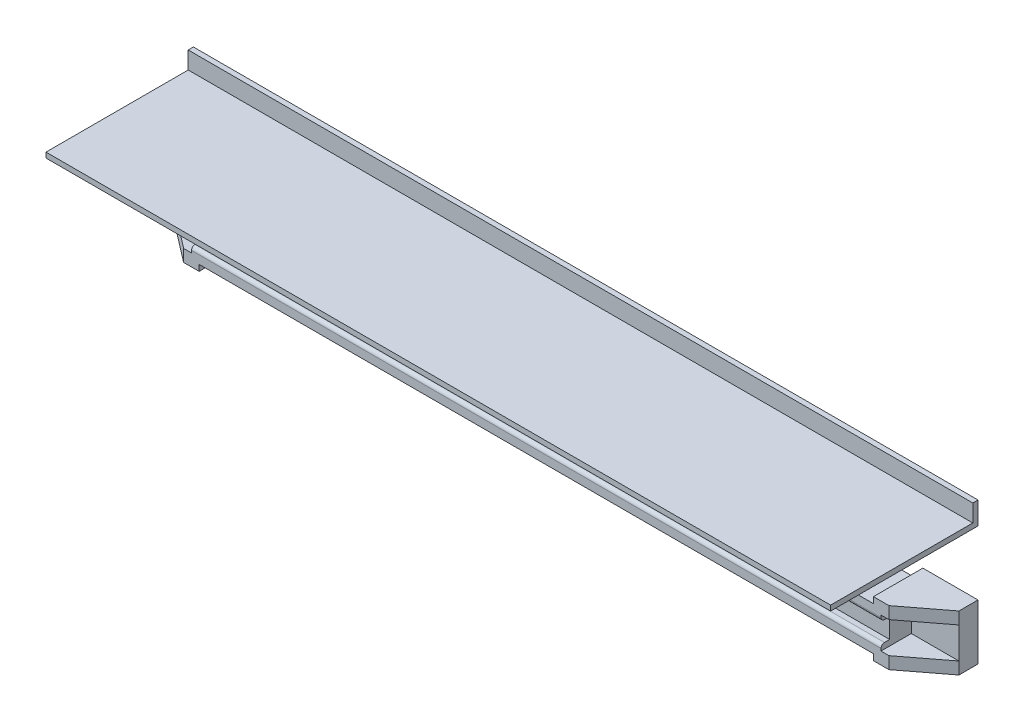
ISO-10303-21;
HEADER;
FILE_DESCRIPTION(('STEP AP214'),'2;1');
FILE_NAME('part.step','',(''),(''),'','','');
FILE_SCHEMA(('AUTOMOTIVE_DESIGN { 1 0 10303 214 1 1 1 1 }'));
ENDSEC;
DATA;
#1=APPLICATION_CONTEXT('core data for automotive mechanical design processes');
#2=APPLICATION_PROTOCOL_DEFINITION('international standard','automotive_design',2000,#1);
#3=PRODUCT_CONTEXT('',#1,'mechanical');
#4=PRODUCT('Part','Part','',(#3));
#5=PRODUCT_RELATED_PRODUCT_CATEGORY('part','',(#4));
#6=PRODUCT_DEFINITION_FORMATION('','',#4);
#7=PRODUCT_DEFINITION_CONTEXT('part definition',#1,'design');
#8=PRODUCT_DEFINITION('design','',#6,#7);
#9=PRODUCT_DEFINITION_SHAPE('','',#8);
#10=(LENGTH_UNIT() NAMED_UNIT(*) SI_UNIT(.MILLI.,.METRE.));
#11=(NAMED_UNIT(*) PLANE_ANGLE_UNIT() SI_UNIT($,.RADIAN.));
#12=(NAMED_UNIT(*) SI_UNIT($,.STERADIAN.) SOLID_ANGLE_UNIT());
#13=UNCERTAINTY_MEASURE_WITH_UNIT(LENGTH_MEASURE(1.E-05),#10,'distance_accuracy_value','');
#14=(GEOMETRIC_REPRESENTATION_CONTEXT(3) GLOBAL_UNCERTAINTY_ASSIGNED_CONTEXT((#13)) GLOBAL_UNIT_ASSIGNED_CONTEXT((#10,
#11,#12)) REPRESENTATION_CONTEXT('',''));
#15=CARTESIAN_POINT('',(0.,0.,0.));
#16=DIRECTION('',(0.,0.,1.));
#17=DIRECTION('',(1.,0.,0.));
#18=AXIS2_PLACEMENT_3D('',#15,#16,#17);
#19=CARTESIAN_POINT('',(-25.,0.,0.));
#20=DIRECTION('',(-1.,0.,0.));
#21=DIRECTION('',(0.,0.,1.));
#22=AXIS2_PLACEMENT_3D('',#19,#20,#21);
#23=PLANE('',#22);
#24=DIRECTION('',(0.,0.,1.));
#25=VECTOR('',#24,1.);
#26=CARTESIAN_POINT('',(-25.,78.4380776840292,-0.500000000000115));
#27=LINE('',#26,#25);
#28=CARTESIAN_POINT('',(-25.,78.4380776840293,-3.50000000000011));
#29=VERTEX_POINT('',#28);
#30=CARTESIAN_POINT('',(-25.,78.4380776840293,-0.500000000000115));
#31=VERTEX_POINT('',#30);
#32=EDGE_CURVE('E52',#29,#31,#27,.T.);
#33=ORIENTED_EDGE('',*,*,#32,.F.);
#34=DIRECTION('',(0.,1.,0.));
#35=VECTOR('',#34,1.);
#36=CARTESIAN_POINT('',(-25.,78.4380776840292,-3.50000000000011));
#37=LINE('',#36,#35);
#38=CARTESIAN_POINT('',(-25.,65.4380776840297,-3.50000000000012));
#39=VERTEX_POINT('',#38);
#40=EDGE_CURVE('E126',#39,#29,#37,.T.);
#41=ORIENTED_EDGE('',*,*,#40,.F.);
#42=DIRECTION('',(0.,0.,-1.));
#43=VECTOR('',#42,1.);
#44=CARTESIAN_POINT('',(-25.,65.4380776840297,-3.50000000000012));
#45=LINE('',#44,#43);
#46=CARTESIAN_POINT('',(-25.,65.4380776840297,81.4999999999974));
#47=VERTEX_POINT('',#46);
#48=EDGE_CURVE('E130',#47,#39,#45,.T.);
#49=ORIENTED_EDGE('',*,*,#48,.F.);
#50=DIRECTION('',(0.,-1.,0.));
#51=VECTOR('',#50,1.);
#52=CARTESIAN_POINT('',(-25.,65.4380776840297,81.4999999999974));
#53=LINE('',#52,#51);
#54=CARTESIAN_POINT('',(-25.,68.4380776840297,81.4999999999974));
#55=VERTEX_POINT('',#54);
#56=EDGE_CURVE('E81',#55,#47,#53,.T.);
#57=ORIENTED_EDGE('',*,*,#56,.F.);
#58=DIRECTION('',(0.,0.,1.));
#59=VECTOR('',#58,1.);
#60=CARTESIAN_POINT('',(-25.,68.4380776840297,81.4999999999974));
#61=LINE('',#60,#59);
#62=CARTESIAN_POINT('',(-25.,68.4380776840297,-0.500000000000115));
#63=VERTEX_POINT('',#62);
#64=EDGE_CURVE('E86',#63,#55,#61,.T.);
#65=ORIENTED_EDGE('',*,*,#64,.F.);
#66=DIRECTION('',(0.,-1.,0.));
#67=VECTOR('',#66,1.);
#68=CARTESIAN_POINT('',(-25.,68.4380776840297,-0.500000000000115));
#69=LINE('',#68,#67);
#70=EDGE_CURVE('E107',#31,#63,#69,.T.);
#71=ORIENTED_EDGE('',*,*,#70,.F.);
#72=EDGE_LOOP('',(#33,#41,#49,#57,#65,#71));
#73=FACE_BOUND('',#72,.T.);
#74=ADVANCED_FACE('F44',(#73),#23,.T.);
#75=CARTESIAN_POINT('',(427.448100551703,0.,0.));
#76=DIRECTION('',(-1.,0.,0.));
#77=DIRECTION('',(0.,0.,1.));
#78=AXIS2_PLACEMENT_3D('',#75,#76,#77);
#79=PLANE('',#78);
#80=DIRECTION('',(0.,0.,1.));
#81=VECTOR('',#80,1.);
#82=CARTESIAN_POINT('',(427.448100551703,78.4380776840293,-0.500000000000115));
#83=LINE('',#82,#81);
#84=CARTESIAN_POINT('',(427.448100551703,78.4380776840293,-3.50000000000011));
#85=VERTEX_POINT('',#84);
#86=CARTESIAN_POINT('',(427.448100551703,78.4380776840293,-0.500000000000115));
#87=VERTEX_POINT('',#86);
#88=EDGE_CURVE('E117',#85,#87,#83,.T.);
#89=ORIENTED_EDGE('',*,*,#88,.T.);
#90=DIRECTION('',(0.,-1.,0.));
#91=VECTOR('',#90,1.);
#92=CARTESIAN_POINT('',(427.448100551703,68.4380776840298,-0.500000000000115));
#93=LINE('',#92,#91);
#94=CARTESIAN_POINT('',(427.448100551703,68.4380776840298,-0.500000000000115));
#95=VERTEX_POINT('',#94);
#96=EDGE_CURVE('E105',#87,#95,#93,.T.);
#97=ORIENTED_EDGE('',*,*,#96,.T.);
#98=DIRECTION('',(0.,0.,1.));
#99=VECTOR('',#98,1.);
#100=CARTESIAN_POINT('',(427.448100551703,68.4380776840298,81.4999999999974));
#101=LINE('',#100,#99);
#102=CARTESIAN_POINT('',(427.448100551703,68.4380776840298,81.4999999999974));
#103=VERTEX_POINT('',#102);
#104=EDGE_CURVE('E109',#95,#103,#101,.T.);
#105=ORIENTED_EDGE('',*,*,#104,.T.);
#106=DIRECTION('',(0.,-1.,0.));
#107=VECTOR('',#106,1.);
#108=CARTESIAN_POINT('',(427.448100551703,65.4380776840298,81.4999999999974));
#109=LINE('',#108,#107);
#110=CARTESIAN_POINT('',(427.448100551703,65.4380776840298,81.4999999999974));
#111=VERTEX_POINT('',#110);
#112=EDGE_CURVE('E113',#103,#111,#109,.T.);
#113=ORIENTED_EDGE('',*,*,#112,.T.);
#114=DIRECTION('',(0.,0.,-1.));
#115=VECTOR('',#114,1.);
#116=CARTESIAN_POINT('',(427.448100551703,65.4380776840298,-3.50000000000012));
#117=LINE('',#116,#115);
#118=CARTESIAN_POINT('',(427.448100551703,65.4380776840298,-3.50000000000012));
#119=VERTEX_POINT('',#118);
#120=EDGE_CURVE('E145',#111,#119,#117,.T.);
#121=ORIENTED_EDGE('',*,*,#120,.T.);
#122=DIRECTION('',(0.,1.,0.));
#123=VECTOR('',#122,1.);
#124=CARTESIAN_POINT('',(427.448100551703,78.4380776840293,-3.50000000000011));
#125=LINE('',#124,#123);
#126=EDGE_CURVE('E123',#119,#85,#125,.T.);
#127=ORIENTED_EDGE('',*,*,#126,.T.);
#128=EDGE_LOOP('',(#89,#97,#105,#113,#121,#127));
#129=FACE_BOUND('',#128,.T.);
#130=ADVANCED_FACE('F115',(#129),#79,.F.);
#131=CARTESIAN_POINT('',(-110.98837130682,68.4380776840297,-0.500000000000115));
#132=DIRECTION('',(0.,0.,1.));
#133=DIRECTION('',(0.,-1.,0.));
#134=AXIS2_PLACEMENT_3D('',#131,#132,#133);
#135=PLANE('',#134);
#136=DIRECTION('',(1.,0.,0.));
#137=VECTOR('',#136,1.);
#138=CARTESIAN_POINT('',(-110.98837130682,78.4380776840292,-0.500000000000115));
#139=LINE('',#138,#137);
#140=EDGE_CURVE('E12',#31,#87,#139,.T.);
#141=ORIENTED_EDGE('',*,*,#140,.F.);
#142=ORIENTED_EDGE('',*,*,#70,.T.);
#143=DIRECTION('',(1.,0.,0.));
#144=VECTOR('',#143,1.);
#145=CARTESIAN_POINT('',(-110.98837130682,68.4380776840297,-0.500000000000115));
#146=LINE('',#145,#144);
#147=EDGE_CURVE('E102',#63,#95,#146,.T.);
#148=ORIENTED_EDGE('',*,*,#147,.T.);
#149=ORIENTED_EDGE('',*,*,#96,.F.);
#150=EDGE_LOOP('',(#141,#142,#148,#149));
#151=FACE_BOUND('',#150,.T.);
#152=ADVANCED_FACE('F103',(#151),#135,.T.);
#153=CARTESIAN_POINT('',(-110.98837130682,68.4380776840297,81.4999999999974));
#154=DIRECTION('',(0.,1.,0.));
#155=DIRECTION('',(-1.,0.,0.));
#156=AXIS2_PLACEMENT_3D('',#153,#154,#155);
#157=PLANE('',#156);
#158=ORIENTED_EDGE('',*,*,#147,.F.);
#159=ORIENTED_EDGE('',*,*,#64,.T.);
#160=DIRECTION('',(1.,0.,0.));
#161=VECTOR('',#160,1.);
#162=CARTESIAN_POINT('',(-110.98837130682,68.4380776840297,81.4999999999974));
#163=LINE('',#162,#161);
#164=EDGE_CURVE('E97',#55,#103,#163,.T.);
#165=ORIENTED_EDGE('',*,*,#164,.T.);
#166=ORIENTED_EDGE('',*,*,#104,.F.);
#167=EDGE_LOOP('',(#158,#159,#165,#166));
#168=FACE_BOUND('',#167,.T.);
#169=ADVANCED_FACE('F110',(#168),#157,.T.);
#170=CARTESIAN_POINT('',(-110.98837130682,65.4380776840297,81.4999999999974));
#171=DIRECTION('',(0.,0.,1.));
#172=DIRECTION('',(1.,0.,0.));
#173=AXIS2_PLACEMENT_3D('',#170,#171,#172);
#174=PLANE('',#173);
#175=ORIENTED_EDGE('',*,*,#164,.F.);
#176=ORIENTED_EDGE('',*,*,#56,.T.);
#177=DIRECTION('',(1.,0.,0.));
#178=VECTOR('',#177,1.);
#179=CARTESIAN_POINT('',(-110.98837130682,65.4380776840297,81.4999999999974));
#180=LINE('',#179,#178);
#181=EDGE_CURVE('E133',#47,#111,#180,.T.);
#182=ORIENTED_EDGE('',*,*,#181,.T.);
#183=ORIENTED_EDGE('',*,*,#112,.F.);
#184=EDGE_LOOP('',(#175,#176,#182,#183));
#185=FACE_BOUND('',#184,.T.);
#186=ADVANCED_FACE('F142',(#185),#174,.T.);
#187=CARTESIAN_POINT('',(-110.98837130682,65.4380776840297,-3.50000000000012));
#188=DIRECTION('',(0.,-1.,0.));
#189=DIRECTION('',(0.,0.,-1.));
#190=AXIS2_PLACEMENT_3D('',#187,#188,#189);
#191=PLANE('',#190);
#192=ORIENTED_EDGE('',*,*,#181,.F.);
#193=ORIENTED_EDGE('',*,*,#48,.T.);
#194=DIRECTION('',(1.,0.,0.));
#195=VECTOR('',#194,1.);
#196=CARTESIAN_POINT('',(-110.98837130682,65.4380776840297,-3.50000000000012));
#197=LINE('',#196,#195);
#198=EDGE_CURVE('E129',#39,#119,#197,.T.);
#199=ORIENTED_EDGE('',*,*,#198,.T.);
#200=ORIENTED_EDGE('',*,*,#120,.F.);
#201=EDGE_LOOP('',(#192,#193,#199,#200));
#202=FACE_BOUND('',#201,.T.);
#203=ADVANCED_FACE('F146',(#202),#191,.T.);
#204=CARTESIAN_POINT('',(-110.98837130682,78.4380776840292,-3.50000000000011));
#205=DIRECTION('',(0.,0.,-1.));
#206=DIRECTION('',(0.,1.,0.));
#207=AXIS2_PLACEMENT_3D('',#204,#205,#206);
#208=PLANE('',#207);
#209=ORIENTED_EDGE('',*,*,#198,.F.);
#210=ORIENTED_EDGE('',*,*,#40,.T.);
#211=DIRECTION('',(1.,0.,0.));
#212=VECTOR('',#211,1.);
#213=CARTESIAN_POINT('',(-110.98837130682,78.4380776840292,-3.50000000000011));
#214=LINE('',#213,#212);
#215=EDGE_CURVE('E125',#29,#85,#214,.T.);
#216=ORIENTED_EDGE('',*,*,#215,.T.);
#217=ORIENTED_EDGE('',*,*,#126,.F.);
#218=EDGE_LOOP('',(#209,#210,#216,#217));
#219=FACE_BOUND('',#218,.T.);
#220=ADVANCED_FACE('F152',(#219),#208,.T.);
#221=CARTESIAN_POINT('',(-110.98837130682,78.4380776840292,-0.500000000000115));
#222=DIRECTION('',(0.,1.,0.));
#223=DIRECTION('',(-1.,0.,0.));
#224=AXIS2_PLACEMENT_3D('',#221,#222,#223);
#225=PLANE('',#224);
#226=ORIENTED_EDGE('',*,*,#215,.F.);
#227=ORIENTED_EDGE('',*,*,#32,.T.);
#228=ORIENTED_EDGE('',*,*,#140,.T.);
#229=ORIENTED_EDGE('',*,*,#88,.F.);
#230=EDGE_LOOP('',(#226,#227,#228,#229));
#231=FACE_BOUND('',#230,.T.);
#232=ADVANCED_FACE('F154',(#231),#225,.T.);
#233=CLOSED_SHELL('',(#74,#130,#152,#169,#186,#203,#220,#232));
#234=MANIFOLD_SOLID_BREP('B2',#233);
#235=CARTESIAN_POINT('',(400.,0.,25.));
#236=DIRECTION('',(-1.,0.,0.));
#237=DIRECTION('',(0.,0.,1.));
#238=AXIS2_PLACEMENT_3D('',#235,#236,#237);
#239=PLANE('',#238);
#240=DIRECTION('',(0.,0.,1.));
#241=VECTOR('',#240,1.);
#242=CARTESIAN_POINT('',(400.,21.5,7.5));
#243=LINE('',#242,#241);
#244=CARTESIAN_POINT('',(400.,21.5,7.5));
#245=VERTEX_POINT('',#244);
#246=CARTESIAN_POINT('',(400.,21.5,25.));
#247=VERTEX_POINT('',#246);
#248=EDGE_CURVE('E461',#245,#247,#243,.T.);
#249=ORIENTED_EDGE('',*,*,#248,.T.);
#250=DIRECTION('',(0.,1.,0.));
#251=VECTOR('',#250,1.);
#252=CARTESIAN_POINT('',(400.,0.,25.));
#253=LINE('',#252,#251);
#254=CARTESIAN_POINT('',(400.,20.2000000000001,25.));
#255=VERTEX_POINT('',#254);
#256=EDGE_CURVE('E427',#255,#247,#253,.T.);
#257=ORIENTED_EDGE('',*,*,#256,.F.);
#258=CARTESIAN_POINT('',(400.,20.2000000000001,23.));
#259=DIRECTION('',(-1.,0.,0.));
#260=DIRECTION('',(0.,0.,1.));
#261=AXIS2_PLACEMENT_3D('',#258,#259,#260);
#262=CIRCLE('',#261,2.);
#263=CARTESIAN_POINT('',(400.,18.2,23.));
#264=VERTEX_POINT('',#263);
#265=EDGE_CURVE('E519',#264,#255,#262,.T.);
#266=ORIENTED_EDGE('',*,*,#265,.F.);
#267=DIRECTION('',(0.,0.,1.));
#268=VECTOR('',#267,1.);
#269=CARTESIAN_POINT('',(400.,18.2,25.));
#270=LINE('',#269,#268);
#271=CARTESIAN_POINT('',(400.,18.2,20.));
#272=VERTEX_POINT('',#271);
#273=EDGE_CURVE('E517',#272,#264,#270,.T.);
#274=ORIENTED_EDGE('',*,*,#273,.F.);
#275=DIRECTION('',(0.,1.,0.));
#276=VECTOR('',#275,1.);
#277=CARTESIAN_POINT('',(400.,0.,20.));
#278=LINE('',#277,#276);
#279=CARTESIAN_POINT('',(400.,6.80000000000005,20.));
#280=VERTEX_POINT('',#279);
#281=EDGE_CURVE('E528',#280,#272,#278,.T.);
#282=ORIENTED_EDGE('',*,*,#281,.F.);
#283=DIRECTION('',(0.,0.,-1.));
#284=VECTOR('',#283,1.);
#285=CARTESIAN_POINT('',(400.,6.80000000000005,25.));
#286=LINE('',#285,#284);
#287=CARTESIAN_POINT('',(400.,6.80000000000005,23.));
#288=VERTEX_POINT('',#287);
#289=EDGE_CURVE('E525',#288,#280,#286,.T.);
#290=ORIENTED_EDGE('',*,*,#289,.F.);
#291=CARTESIAN_POINT('',(400.,4.80000000000005,23.));
#292=DIRECTION('',(-1.,0.,0.));
#293=DIRECTION('',(0.,0.,1.));
#294=AXIS2_PLACEMENT_3D('',#291,#292,#293);
#295=CIRCLE('',#294,2.);
#296=CARTESIAN_POINT('',(400.,4.80000000000003,25.));
#297=VERTEX_POINT('',#296);
#298=EDGE_CURVE('E522',#297,#288,#295,.T.);
#299=ORIENTED_EDGE('',*,*,#298,.F.);
#300=CARTESIAN_POINT('',(400.,3.50000000000002,25.));
#301=VERTEX_POINT('',#300);
#302=EDGE_CURVE('E601',#301,#297,#253,.T.);
#303=ORIENTED_EDGE('',*,*,#302,.F.);
#304=DIRECTION('',(0.,0.,1.));
#305=VECTOR('',#304,1.);
#306=CARTESIAN_POINT('',(400.,3.50000000000002,7.5));
#307=LINE('',#306,#305);
#308=CARTESIAN_POINT('',(400.,3.50000000000002,7.5));
#309=VERTEX_POINT('',#308);
#310=EDGE_CURVE('E460',#309,#301,#307,.T.);
#311=ORIENTED_EDGE('',*,*,#310,.F.);
#312=DIRECTION('',(0.,1.,0.));
#313=VECTOR('',#312,1.);
#314=CARTESIAN_POINT('',(400.,21.5,7.5));
#315=LINE('',#314,#313);
#316=EDGE_CURVE('E456',#309,#245,#315,.T.);
#317=ORIENTED_EDGE('',*,*,#316,.T.);
#318=EDGE_LOOP('',(#249,#257,#266,#274,#282,#290,#299,#303,#311,#317));
#319=FACE_BOUND('',#318,.T.);
#320=ADVANCED_FACE('F219',(#319),#239,.F.);
#321=CARTESIAN_POINT('',(0.,0.,25.));
#322=DIRECTION('',(0.,1.,0.));
#323=DIRECTION('',(0.,0.,1.));
#324=AXIS2_PLACEMENT_3D('',#321,#322,#323);
#325=PLANE('',#324);
#326=DIRECTION('',(0.,0.,-1.));
#327=VECTOR('',#326,1.);
#328=CARTESIAN_POINT('',(395.648100551703,0.,25.));
#329=LINE('',#328,#327);
#330=CARTESIAN_POINT('',(395.648100551703,0.,25.));
#331=VERTEX_POINT('',#330);
#332=CARTESIAN_POINT('',(395.648100551703,0.,0.));
#333=VERTEX_POINT('',#332);
#334=EDGE_CURVE('E234',#331,#333,#329,.T.);
#335=ORIENTED_EDGE('',*,*,#334,.F.);
#336=DIRECTION('',(1.,0.,0.));
#337=VECTOR('',#336,1.);
#338=CARTESIAN_POINT('',(0.,0.,25.));
#339=LINE('',#338,#337);
#340=CARTESIAN_POINT('',(6.8,0.,25.));
#341=VERTEX_POINT('',#340);
#342=EDGE_CURVE('E597',#341,#331,#339,.T.);
#343=ORIENTED_EDGE('',*,*,#342,.F.);
#344=DIRECTION('',(0.,0.,-1.));
#345=VECTOR('',#344,1.);
#346=CARTESIAN_POINT('',(6.8,0.,25.));
#347=LINE('',#346,#345);
#348=CARTESIAN_POINT('',(6.8,0.,0.));
#349=VERTEX_POINT('',#348);
#350=EDGE_CURVE('E565',#341,#349,#347,.T.);
#351=ORIENTED_EDGE('',*,*,#350,.T.);
#352=DIRECTION('',(1.,0.,0.));
#353=VECTOR('',#352,1.);
#354=CARTESIAN_POINT('',(0.,0.,0.));
#355=LINE('',#354,#353);
#356=EDGE_CURVE('E596',#349,#333,#355,.T.);
#357=ORIENTED_EDGE('',*,*,#356,.T.);
#358=EDGE_LOOP('',(#335,#343,#351,#357));
#359=FACE_BOUND('',#358,.T.);
#360=ADVANCED_FACE('F221',(#359),#325,.F.);
#361=CARTESIAN_POINT('',(0.,25.,25.));
#362=DIRECTION('',(0.,-1.,0.));
#363=DIRECTION('',(0.,0.,-1.));
#364=AXIS2_PLACEMENT_3D('',#361,#362,#363);
#365=PLANE('',#364);
#366=DIRECTION('',(0.,0.,1.));
#367=VECTOR('',#366,1.);
#368=CARTESIAN_POINT('',(395.648100551703,25.,0.));
#369=LINE('',#368,#367);
#370=CARTESIAN_POINT('',(395.648100551703,25.,0.));
#371=VERTEX_POINT('',#370);
#372=CARTESIAN_POINT('',(395.648100551703,25.,25.));
#373=VERTEX_POINT('',#372);
#374=EDGE_CURVE('E463',#371,#373,#369,.T.);
#375=ORIENTED_EDGE('',*,*,#374,.F.);
#376=DIRECTION('',(-1.,0.,0.));
#377=VECTOR('',#376,1.);
#378=CARTESIAN_POINT('',(0.,25.,0.));
#379=LINE('',#378,#377);
#380=CARTESIAN_POINT('',(6.8,25.,0.));
#381=VERTEX_POINT('',#380);
#382=EDGE_CURVE('E600',#371,#381,#379,.T.);
#383=ORIENTED_EDGE('',*,*,#382,.T.);
#384=DIRECTION('',(0.,0.,1.));
#385=VECTOR('',#384,1.);
#386=CARTESIAN_POINT('',(6.8,25.,0.));
#387=LINE('',#386,#385);
#388=CARTESIAN_POINT('',(6.8,25.,25.));
#389=VERTEX_POINT('',#388);
#390=EDGE_CURVE('E560',#381,#389,#387,.T.);
#391=ORIENTED_EDGE('',*,*,#390,.T.);
#392=DIRECTION('',(-1.,0.,0.));
#393=VECTOR('',#392,1.);
#394=CARTESIAN_POINT('',(0.,25.,25.));
#395=LINE('',#394,#393);
#396=EDGE_CURVE('E603',#373,#389,#395,.T.);
#397=ORIENTED_EDGE('',*,*,#396,.F.);
#398=EDGE_LOOP('',(#375,#383,#391,#397));
#399=FACE_BOUND('',#398,.T.);
#400=ADVANCED_FACE('F721',(#399),#365,.F.);
#401=CARTESIAN_POINT('',(0.,0.,0.));
#402=DIRECTION('',(0.,0.,-1.));
#403=DIRECTION('',(-1.,0.,0.));
#404=AXIS2_PLACEMENT_3D('',#401,#402,#403);
#405=PLANE('',#404);
#406=ORIENTED_EDGE('',*,*,#382,.F.);
#407=DIRECTION('',(0.,1.,0.));
#408=VECTOR('',#407,1.);
#409=CARTESIAN_POINT('',(395.648100551703,0.,0.));
#410=LINE('',#409,#408);
#411=EDGE_CURVE('E468',#333,#371,#410,.T.);
#412=ORIENTED_EDGE('',*,*,#411,.F.);
#413=ORIENTED_EDGE('',*,*,#356,.F.);
#414=DIRECTION('',(0.,1.,0.));
#415=VECTOR('',#414,1.);
#416=CARTESIAN_POINT('',(6.8,0.,0.));
#417=LINE('',#416,#415);
#418=EDGE_CURVE('E568',#349,#381,#417,.T.);
#419=ORIENTED_EDGE('',*,*,#418,.T.);
#420=EDGE_LOOP('',(#406,#412,#413,#419));
#421=FACE_BOUND('',#420,.T.);
#422=ADVANCED_FACE('F725',(#421),#405,.T.);
#423=CARTESIAN_POINT('',(-25.,28.5,28.5));
#424=DIRECTION('',(0.,-1.,0.));
#425=DIRECTION('',(0.,0.,-1.));
#426=AXIS2_PLACEMENT_3D('',#423,#424,#425);
#427=PLANE('',#426);
#428=DIRECTION('',(-1.,0.,0.));
#429=VECTOR('',#428,1.);
#430=CARTESIAN_POINT('',(-25.,28.5,25.));
#431=LINE('',#430,#429);
#432=CARTESIAN_POINT('',(6.79999999999999,28.5,25.));
#433=VERTEX_POINT('',#432);
#434=CARTESIAN_POINT('',(-2.12658287358067,28.5,25.));
#435=VERTEX_POINT('',#434);
#436=EDGE_CURVE('E242',#433,#435,#431,.T.);
#437=ORIENTED_EDGE('',*,*,#436,.F.);
#438=DIRECTION('',(0.,0.,1.));
#439=VECTOR('',#438,1.);
#440=CARTESIAN_POINT('',(6.8,28.5,-3.5));
#441=LINE('',#440,#439);
#442=CARTESIAN_POINT('',(6.8,28.5,-3.5));
#443=VERTEX_POINT('',#442);
#444=EDGE_CURVE('E576',#443,#433,#441,.T.);
#445=ORIENTED_EDGE('',*,*,#444,.F.);
#446=DIRECTION('',(1.,0.,0.));
#447=VECTOR('',#446,1.);
#448=CARTESIAN_POINT('',(-25.,28.5,-3.5));
#449=LINE('',#448,#447);
#450=CARTESIAN_POINT('',(-25.,28.5,-3.5));
#451=VERTEX_POINT('',#450);
#452=EDGE_CURVE('E587',#451,#443,#449,.T.);
#453=ORIENTED_EDGE('',*,*,#452,.F.);
#454=DIRECTION('',(0.,0.,-1.));
#455=VECTOR('',#454,1.);
#456=CARTESIAN_POINT('',(-25.,28.5,28.5));
#457=LINE('',#456,#455);
#458=CARTESIAN_POINT('',(-25.,28.5,7.5));
#459=VERTEX_POINT('',#458);
#460=EDGE_CURVE('E585',#459,#451,#457,.T.);
#461=ORIENTED_EDGE('',*,*,#460,.F.);
#462=DIRECTION('',(-0.794214335112172,0.,-0.607637712705796));
#463=VECTOR('',#462,1.);
#464=CARTESIAN_POINT('',(-14.8655137783,28.5,15.2536953879489));
#465=LINE('',#464,#463);
#466=EDGE_CURVE('E542',#435,#459,#465,.T.);
#467=ORIENTED_EDGE('',*,*,#466,.F.);
#468=EDGE_LOOP('',(#437,#445,#453,#461,#467));
#469=FACE_BOUND('',#468,.T.);
#470=ADVANCED_FACE('F729',(#469),#427,.F.);
#471=CARTESIAN_POINT('',(-25.,-3.50000000000001,-3.5));
#472=DIRECTION('',(0.,1.,0.));
#473=DIRECTION('',(0.,0.,1.));
#474=AXIS2_PLACEMENT_3D('',#471,#472,#473);
#475=PLANE('',#474);
#476=DIRECTION('',(1.,0.,0.));
#477=VECTOR('',#476,1.);
#478=CARTESIAN_POINT('',(-25.,-3.50000000000001,25.));
#479=LINE('',#478,#477);
#480=CARTESIAN_POINT('',(-2.12658287358067,-3.5,25.));
#481=VERTEX_POINT('',#480);
#482=CARTESIAN_POINT('',(6.8,-3.50000000000001,25.));
#483=VERTEX_POINT('',#482);
#484=EDGE_CURVE('E511',#481,#483,#479,.T.);
#485=ORIENTED_EDGE('',*,*,#484,.F.);
#486=DIRECTION('',(-0.794214335112172,0.,-0.607637712705796));
#487=VECTOR('',#486,1.);
#488=CARTESIAN_POINT('',(-12.8500491124511,-3.50000000000001,16.7956876253754));
#489=LINE('',#488,#487);
#490=CARTESIAN_POINT('',(-25.,-3.50000000000001,7.5));
#491=VERTEX_POINT('',#490);
#492=EDGE_CURVE('E531',#481,#491,#489,.T.);
#493=ORIENTED_EDGE('',*,*,#492,.T.);
#494=DIRECTION('',(0.,0.,1.));
#495=VECTOR('',#494,1.);
#496=CARTESIAN_POINT('',(-25.,-3.50000000000001,-3.5));
#497=LINE('',#496,#495);
#498=CARTESIAN_POINT('',(-25.,-3.50000000000001,-3.5));
#499=VERTEX_POINT('',#498);
#500=EDGE_CURVE('E582',#499,#491,#497,.T.);
#501=ORIENTED_EDGE('',*,*,#500,.F.);
#502=DIRECTION('',(1.,0.,0.));
#503=VECTOR('',#502,1.);
#504=CARTESIAN_POINT('',(-25.,-3.50000000000001,-3.5));
#505=LINE('',#504,#503);
#506=CARTESIAN_POINT('',(6.8,-3.5,-3.5));
#507=VERTEX_POINT('',#506);
#508=EDGE_CURVE('E589',#499,#507,#505,.T.);
#509=ORIENTED_EDGE('',*,*,#508,.T.);
#510=DIRECTION('',(0.,0.,-1.));
#511=VECTOR('',#510,1.);
#512=CARTESIAN_POINT('',(6.8,-3.5,28.5));
#513=LINE('',#512,#511);
#514=EDGE_CURVE('E571',#483,#507,#513,.T.);
#515=ORIENTED_EDGE('',*,*,#514,.F.);
#516=EDGE_LOOP('',(#485,#493,#501,#509,#515));
#517=FACE_BOUND('',#516,.T.);
#518=ADVANCED_FACE('F656',(#517),#475,.F.);
#519=CARTESIAN_POINT('',(-25.,21.5,7.5));
#520=DIRECTION('',(0.,1.,0.));
#521=DIRECTION('',(0.,0.,1.));
#522=AXIS2_PLACEMENT_3D('',#519,#520,#521);
#523=PLANE('',#522);
#524=DIRECTION('',(1.,0.,0.));
#525=VECTOR('',#524,1.);
#526=CARTESIAN_POINT('',(-25.,21.5,25.));
#527=LINE('',#526,#525);
#528=CARTESIAN_POINT('',(-2.12658287358067,21.5,25.));
#529=VERTEX_POINT('',#528);
#530=CARTESIAN_POINT('',(2.44810055170319,21.5,25.));
#531=VERTEX_POINT('',#530);
#532=EDGE_CURVE('E502',#529,#531,#527,.T.);
#533=ORIENTED_EDGE('',*,*,#532,.F.);
#534=DIRECTION('',(0.794214335112172,0.,0.607637712705796));
#535=VECTOR('',#534,1.);
#536=CARTESIAN_POINT('',(-25.,21.5,7.49999999999999));
#537=LINE('',#536,#535);
#538=CARTESIAN_POINT('',(-25.,21.5,7.5));
#539=VERTEX_POINT('',#538);
#540=EDGE_CURVE('E539',#539,#529,#537,.T.);
#541=ORIENTED_EDGE('',*,*,#540,.F.);
#542=DIRECTION('',(-1.,0.,0.));
#543=VECTOR('',#542,1.);
#544=CARTESIAN_POINT('',(-25.,21.5,7.5));
#545=LINE('',#544,#543);
#546=CARTESIAN_POINT('',(2.44810055170319,21.5,7.5));
#547=VERTEX_POINT('',#546);
#548=EDGE_CURVE('E553',#547,#539,#545,.T.);
#549=ORIENTED_EDGE('',*,*,#548,.F.);
#550=DIRECTION('',(0.,0.,1.));
#551=VECTOR('',#550,1.);
#552=CARTESIAN_POINT('',(2.44810055170319,21.5,7.5));
#553=LINE('',#552,#551);
#554=EDGE_CURVE('E557',#547,#531,#553,.T.);
#555=ORIENTED_EDGE('',*,*,#554,.T.);
#556=EDGE_LOOP('',(#533,#541,#549,#555));
#557=FACE_BOUND('',#556,.T.);
#558=ADVANCED_FACE('F701',(#557),#523,.F.);
#559=CARTESIAN_POINT('',(-25.,3.49999999999999,7.5));
#560=DIRECTION('',(0.,-1.,0.));
#561=DIRECTION('',(0.,0.,-1.));
#562=AXIS2_PLACEMENT_3D('',#559,#560,#561);
#563=PLANE('',#562);
#564=DIRECTION('',(-1.,0.,0.));
#565=VECTOR('',#564,1.);
#566=CARTESIAN_POINT('',(-25.,3.49999999999999,25.));
#567=LINE('',#566,#565);
#568=CARTESIAN_POINT('',(2.44810055170319,3.49999999999999,25.));
#569=VERTEX_POINT('',#568);
#570=CARTESIAN_POINT('',(-2.12658287358067,3.5,25.));
#571=VERTEX_POINT('',#570);
#572=EDGE_CURVE('E509',#569,#571,#567,.T.);
#573=ORIENTED_EDGE('',*,*,#572,.F.);
#574=DIRECTION('',(0.,0.,1.));
#575=VECTOR('',#574,1.);
#576=CARTESIAN_POINT('',(2.44810055170319,3.49999999999999,7.5));
#577=LINE('',#576,#575);
#578=CARTESIAN_POINT('',(2.44810055170319,3.49999999999999,7.5));
#579=VERTEX_POINT('',#578);
#580=EDGE_CURVE('E556',#579,#569,#577,.T.);
#581=ORIENTED_EDGE('',*,*,#580,.F.);
#582=DIRECTION('',(1.,0.,0.));
#583=VECTOR('',#582,1.);
#584=CARTESIAN_POINT('',(-25.,3.49999999999999,7.5));
#585=LINE('',#584,#583);
#586=CARTESIAN_POINT('',(-25.,3.5,7.5));
#587=VERTEX_POINT('',#586);
#588=EDGE_CURVE('E547',#587,#579,#585,.T.);
#589=ORIENTED_EDGE('',*,*,#588,.F.);
#590=DIRECTION('',(-0.794214335112172,0.,-0.607637712705796));
#591=VECTOR('',#590,1.);
#592=CARTESIAN_POINT('',(-25.,3.49999999999999,7.5));
#593=LINE('',#592,#591);
#594=EDGE_CURVE('E537',#571,#587,#593,.T.);
#595=ORIENTED_EDGE('',*,*,#594,.F.);
#596=EDGE_LOOP('',(#573,#581,#589,#595));
#597=FACE_BOUND('',#596,.T.);
#598=ADVANCED_FACE('F642',(#597),#563,.F.);
#599=CARTESIAN_POINT('',(0.,0.,25.));
#600=DIRECTION('',(0.,0.,-1.));
#601=DIRECTION('',(-1.,0.,0.));
#602=AXIS2_PLACEMENT_3D('',#599,#600,#601);
#603=PLANE('',#602);
#604=DIRECTION('',(1.,0.,0.));
#605=VECTOR('',#604,1.);
#606=CARTESIAN_POINT('',(427.448100551703,3.50000000000002,25.));
#607=LINE('',#606,#605);
#608=CARTESIAN_POINT('',(404.574683425284,3.50000000000002,25.));
#609=VERTEX_POINT('',#608);
#610=EDGE_CURVE('E434',#301,#609,#607,.T.);
#611=ORIENTED_EDGE('',*,*,#610,.F.);
#612=ORIENTED_EDGE('',*,*,#302,.T.);
#613=DIRECTION('',(1.,0.,0.));
#614=VECTOR('',#613,1.);
#615=CARTESIAN_POINT('',(-40.5518994482968,4.79999999999998,25.));
#616=LINE('',#615,#614);
#617=CARTESIAN_POINT('',(2.44810055170319,4.79999999999999,25.));
#618=VERTEX_POINT('',#617);
#619=EDGE_CURVE('E497',#618,#297,#616,.T.);
#620=ORIENTED_EDGE('',*,*,#619,.F.);
#621=DIRECTION('',(0.,-1.,0.));
#622=VECTOR('',#621,1.);
#623=CARTESIAN_POINT('',(2.44810055170319,21.5,25.));
#624=LINE('',#623,#622);
#625=EDGE_CURVE('E513',#618,#569,#624,.T.);
#626=ORIENTED_EDGE('',*,*,#625,.T.);
#627=ORIENTED_EDGE('',*,*,#572,.T.);
#628=DIRECTION('',(0.,1.,0.));
#629=VECTOR('',#628,1.);
#630=CARTESIAN_POINT('',(-2.12658287358067,39.5,25.));
#631=LINE('',#630,#629);
#632=EDGE_CURVE('E610',#481,#571,#631,.T.);
#633=ORIENTED_EDGE('',*,*,#632,.F.);
#634=ORIENTED_EDGE('',*,*,#484,.T.);
#635=DIRECTION('',(0.,1.,0.));
#636=VECTOR('',#635,1.);
#637=CARTESIAN_POINT('',(6.8,18.2,25.));
#638=LINE('',#637,#636);
#639=EDGE_CURVE('E515',#483,#341,#638,.T.);
#640=ORIENTED_EDGE('',*,*,#639,.T.);
#641=ORIENTED_EDGE('',*,*,#342,.T.);
#642=DIRECTION('',(0.,1.,0.));
#643=VECTOR('',#642,1.);
#644=CARTESIAN_POINT('',(395.648100551703,18.2,25.));
#645=LINE('',#644,#643);
#646=CARTESIAN_POINT('',(395.648100551703,-3.49999999999998,25.));
#647=VERTEX_POINT('',#646);
#648=EDGE_CURVE('E440',#647,#331,#645,.T.);
#649=ORIENTED_EDGE('',*,*,#648,.F.);
#650=DIRECTION('',(-1.,0.,0.));
#651=VECTOR('',#650,1.);
#652=CARTESIAN_POINT('',(427.448100551703,-3.49999999999998,25.));
#653=LINE('',#652,#651);
#654=CARTESIAN_POINT('',(404.574683425284,-3.49999999999998,25.));
#655=VERTEX_POINT('',#654);
#656=EDGE_CURVE('E437',#655,#647,#653,.T.);
#657=ORIENTED_EDGE('',*,*,#656,.F.);
#658=DIRECTION('',(0.,1.,0.));
#659=VECTOR('',#658,1.);
#660=CARTESIAN_POINT('',(404.574683425284,39.5,25.));
#661=LINE('',#660,#659);
#662=EDGE_CURVE('E413',#655,#609,#661,.T.);
#663=ORIENTED_EDGE('',*,*,#662,.T.);
#664=EDGE_LOOP('',(#611,#612,#620,#626,#627,#633,#634,#640,#641,#649,#657,#663));
#665=FACE_BOUND('',#664,.T.);
#666=ADVANCED_FACE('F639',(#665),#603,.F.);
#667=CARTESIAN_POINT('',(6.8,18.2,20.));
#668=DIRECTION('',(-1.,0.,0.));
#669=DIRECTION('',(0.,-1.,0.));
#670=AXIS2_PLACEMENT_3D('',#667,#668,#669);
#671=PLANE('',#670);
#672=ORIENTED_EDGE('',*,*,#639,.F.);
#673=ORIENTED_EDGE('',*,*,#514,.T.);
#674=DIRECTION('',(0.,1.,0.));
#675=VECTOR('',#674,1.);
#676=CARTESIAN_POINT('',(6.8,-3.5,-3.5));
#677=LINE('',#676,#675);
#678=EDGE_CURVE('E573',#507,#443,#677,.T.);
#679=ORIENTED_EDGE('',*,*,#678,.T.);
#680=ORIENTED_EDGE('',*,*,#444,.T.);
#681=DIRECTION('',(0.,1.,0.));
#682=VECTOR('',#681,1.);
#683=CARTESIAN_POINT('',(6.8,18.2,25.));
#684=LINE('',#683,#682);
#685=EDGE_CURVE('E507',#389,#433,#684,.T.);
#686=ORIENTED_EDGE('',*,*,#685,.F.);
#687=ORIENTED_EDGE('',*,*,#390,.F.);
#688=ORIENTED_EDGE('',*,*,#418,.F.);
#689=ORIENTED_EDGE('',*,*,#350,.F.);
#690=EDGE_LOOP('',(#672,#673,#679,#680,#686,#687,#688,#689));
#691=FACE_BOUND('',#690,.T.);
#692=ADVANCED_FACE('F662',(#691),#671,.F.);
#693=CARTESIAN_POINT('',(2.44810055170319,21.5,7.5));
#694=DIRECTION('',(1.,0.,0.));
#695=DIRECTION('',(0.,1.,0.));
#696=AXIS2_PLACEMENT_3D('',#693,#694,#695);
#697=PLANE('',#696);
#698=ORIENTED_EDGE('',*,*,#625,.F.);
#699=CARTESIAN_POINT('',(2.44810055170319,4.8,23.));
#700=DIRECTION('',(1.,0.,0.));
#701=DIRECTION('',(0.,1.,0.));
#702=AXIS2_PLACEMENT_3D('',#699,#700,#701);
#703=CIRCLE('',#702,2.);
#704=CARTESIAN_POINT('',(2.44810055170319,6.8,23.));
#705=VERTEX_POINT('',#704);
#706=EDGE_CURVE('E42',#705,#618,#703,.T.);
#707=ORIENTED_EDGE('',*,*,#706,.F.);
#708=DIRECTION('',(0.,0.,1.));
#709=VECTOR('',#708,1.);
#710=CARTESIAN_POINT('',(2.44810055170319,6.8,7.5));
#711=LINE('',#710,#709);
#712=CARTESIAN_POINT('',(2.44810055170319,6.8,20.));
#713=VERTEX_POINT('',#712);
#714=EDGE_CURVE('E227',#713,#705,#711,.T.);
#715=ORIENTED_EDGE('',*,*,#714,.F.);
#716=DIRECTION('',(0.,-1.,0.));
#717=VECTOR('',#716,1.);
#718=CARTESIAN_POINT('',(2.44810055170319,21.5,20.));
#719=LINE('',#718,#717);
#720=CARTESIAN_POINT('',(2.44810055170319,18.2,20.));
#721=VERTEX_POINT('',#720);
#722=EDGE_CURVE('E619',#721,#713,#719,.T.);
#723=ORIENTED_EDGE('',*,*,#722,.F.);
#724=DIRECTION('',(0.,0.,-1.));
#725=VECTOR('',#724,1.);
#726=CARTESIAN_POINT('',(2.44810055170319,18.2,7.5));
#727=LINE('',#726,#725);
#728=CARTESIAN_POINT('',(2.44810055170319,18.2,23.));
#729=VERTEX_POINT('',#728);
#730=EDGE_CURVE('E613',#729,#721,#727,.T.);
#731=ORIENTED_EDGE('',*,*,#730,.F.);
#732=CARTESIAN_POINT('',(2.44810055170319,20.2,23.));
#733=DIRECTION('',(1.,0.,0.));
#734=DIRECTION('',(0.,1.,0.));
#735=AXIS2_PLACEMENT_3D('',#732,#733,#734);
#736=CIRCLE('',#735,2.);
#737=CARTESIAN_POINT('',(2.44810055170319,20.2,25.));
#738=VERTEX_POINT('',#737);
#739=EDGE_CURVE('E616',#738,#729,#736,.T.);
#740=ORIENTED_EDGE('',*,*,#739,.F.);
#741=DIRECTION('',(0.,-1.,0.));
#742=VECTOR('',#741,1.);
#743=CARTESIAN_POINT('',(2.44810055170319,21.5,25.));
#744=LINE('',#743,#742);
#745=EDGE_CURVE('E505',#531,#738,#744,.T.);
#746=ORIENTED_EDGE('',*,*,#745,.F.);
#747=ORIENTED_EDGE('',*,*,#554,.F.);
#748=DIRECTION('',(0.,1.,0.));
#749=VECTOR('',#748,1.);
#750=CARTESIAN_POINT('',(2.44810055170319,21.5,7.5));
#751=LINE('',#750,#749);
#752=EDGE_CURVE('E550',#579,#547,#751,.T.);
#753=ORIENTED_EDGE('',*,*,#752,.F.);
#754=ORIENTED_EDGE('',*,*,#580,.T.);
#755=EDGE_LOOP('',(#698,#707,#715,#723,#731,#740,#746,#747,#753,#754));
#756=FACE_BOUND('',#755,.T.);
#757=ADVANCED_FACE('F634',(#756),#697,.F.);
#758=CARTESIAN_POINT('',(-12.8500491124511,39.5,16.7956876253754));
#759=DIRECTION('',(-0.607637712705796,0.,0.794214335112172));
#760=DIRECTION('',(0.794214335112172,0.,0.607637712705796));
#761=AXIS2_PLACEMENT_3D('',#758,#759,#760);
#762=PLANE('',#761);
#763=ORIENTED_EDGE('',*,*,#492,.F.);
#764=ORIENTED_EDGE('',*,*,#632,.T.);
#765=ORIENTED_EDGE('',*,*,#594,.T.);
#766=DIRECTION('',(0.,-1.,0.));
#767=VECTOR('',#766,1.);
#768=CARTESIAN_POINT('',(-25.,39.5,7.5));
#769=LINE('',#768,#767);
#770=EDGE_CURVE('E533',#587,#491,#769,.T.);
#771=ORIENTED_EDGE('',*,*,#770,.T.);
#772=EDGE_LOOP('',(#763,#764,#765,#771));
#773=FACE_BOUND('',#772,.T.);
#774=ADVANCED_FACE('F647',(#773),#762,.T.);
#775=ORIENTED_EDGE('',*,*,#540,.T.);
#776=DIRECTION('',(0.,1.,0.));
#777=VECTOR('',#776,1.);
#778=CARTESIAN_POINT('',(-2.12658287358067,39.5,25.));
#779=LINE('',#778,#777);
#780=EDGE_CURVE('E605',#529,#435,#779,.T.);
#781=ORIENTED_EDGE('',*,*,#780,.T.);
#782=ORIENTED_EDGE('',*,*,#466,.T.);
#783=EDGE_CURVE('E536',#459,#539,#769,.T.);
#784=ORIENTED_EDGE('',*,*,#783,.T.);
#785=EDGE_LOOP('',(#775,#781,#782,#784));
#786=FACE_BOUND('',#785,.T.);
#787=ADVANCED_FACE('F749',(#786),#762,.T.);
#788=CARTESIAN_POINT('',(-25.,0.,0.));
#789=DIRECTION('',(-1.,0.,0.));
#790=DIRECTION('',(0.,0.,1.));
#791=AXIS2_PLACEMENT_3D('',#788,#789,#790);
#792=PLANE('',#791);
#793=ORIENTED_EDGE('',*,*,#500,.T.);
#794=ORIENTED_EDGE('',*,*,#770,.F.);
#795=DIRECTION('',(0.,-1.,0.));
#796=VECTOR('',#795,1.);
#797=CARTESIAN_POINT('',(-25.,21.5,7.5));
#798=LINE('',#797,#796);
#799=EDGE_CURVE('E544',#539,#587,#798,.T.);
#800=ORIENTED_EDGE('',*,*,#799,.F.);
#801=ORIENTED_EDGE('',*,*,#783,.F.);
#802=ORIENTED_EDGE('',*,*,#460,.T.);
#803=DIRECTION('',(0.,-1.,0.));
#804=VECTOR('',#803,1.);
#805=CARTESIAN_POINT('',(-25.,28.5,-3.5));
#806=LINE('',#805,#804);
#807=EDGE_CURVE('E579',#451,#499,#806,.T.);
#808=ORIENTED_EDGE('',*,*,#807,.T.);
#809=EDGE_LOOP('',(#793,#794,#800,#801,#802,#808));
#810=FACE_BOUND('',#809,.T.);
#811=ADVANCED_FACE('F650',(#810),#792,.T.);
#812=ORIENTED_EDGE('',*,*,#256,.T.);
#813=DIRECTION('',(-1.,0.,0.));
#814=VECTOR('',#813,1.);
#815=CARTESIAN_POINT('',(427.448100551703,21.5,25.));
#816=LINE('',#815,#814);
#817=CARTESIAN_POINT('',(404.574683425284,21.5,25.));
#818=VERTEX_POINT('',#817);
#819=EDGE_CURVE('E419',#818,#247,#816,.T.);
#820=ORIENTED_EDGE('',*,*,#819,.F.);
#821=DIRECTION('',(0.,1.,0.));
#822=VECTOR('',#821,1.);
#823=CARTESIAN_POINT('',(404.574683425284,39.5,25.));
#824=LINE('',#823,#822);
#825=CARTESIAN_POINT('',(404.574683425284,28.5,25.));
#826=VERTEX_POINT('',#825);
#827=EDGE_CURVE('E403',#818,#826,#824,.T.);
#828=ORIENTED_EDGE('',*,*,#827,.T.);
#829=DIRECTION('',(1.,0.,0.));
#830=VECTOR('',#829,1.);
#831=CARTESIAN_POINT('',(427.448100551703,28.5,25.));
#832=LINE('',#831,#830);
#833=CARTESIAN_POINT('',(395.648100551703,28.5,25.));
#834=VERTEX_POINT('',#833);
#835=EDGE_CURVE('E428',#834,#826,#832,.T.);
#836=ORIENTED_EDGE('',*,*,#835,.F.);
#837=DIRECTION('',(0.,1.,0.));
#838=VECTOR('',#837,1.);
#839=CARTESIAN_POINT('',(395.648100551703,18.2,25.));
#840=LINE('',#839,#838);
#841=EDGE_CURVE('E430',#373,#834,#840,.T.);
#842=ORIENTED_EDGE('',*,*,#841,.F.);
#843=ORIENTED_EDGE('',*,*,#396,.T.);
#844=ORIENTED_EDGE('',*,*,#685,.T.);
#845=ORIENTED_EDGE('',*,*,#436,.T.);
#846=ORIENTED_EDGE('',*,*,#780,.F.);
#847=ORIENTED_EDGE('',*,*,#532,.T.);
#848=ORIENTED_EDGE('',*,*,#745,.T.);
#849=DIRECTION('',(1.,0.,0.));
#850=VECTOR('',#849,1.);
#851=CARTESIAN_POINT('',(-40.5518994482968,20.2,25.));
#852=LINE('',#851,#850);
#853=EDGE_CURVE('E495',#738,#255,#852,.T.);
#854=ORIENTED_EDGE('',*,*,#853,.T.);
#855=EDGE_LOOP('',(#812,#820,#828,#836,#842,#843,#844,#845,#846,#847,#848,#854));
#856=FACE_BOUND('',#855,.T.);
#857=ADVANCED_FACE('F425',(#856),#603,.F.);
#858=CARTESIAN_POINT('',(-25.,28.5,-3.5));
#859=DIRECTION('',(0.,0.,1.));
#860=DIRECTION('',(1.,0.,0.));
#861=AXIS2_PLACEMENT_3D('',#858,#859,#860);
#862=PLANE('',#861);
#863=ORIENTED_EDGE('',*,*,#452,.T.);
#864=ORIENTED_EDGE('',*,*,#678,.F.);
#865=ORIENTED_EDGE('',*,*,#508,.F.);
#866=ORIENTED_EDGE('',*,*,#807,.F.);
#867=EDGE_LOOP('',(#863,#864,#865,#866));
#868=FACE_BOUND('',#867,.T.);
#869=ADVANCED_FACE('F706',(#868),#862,.F.);
#870=CARTESIAN_POINT('',(0.,0.,7.5));
#871=DIRECTION('',(0.,0.,1.));
#872=DIRECTION('',(1.,0.,0.));
#873=AXIS2_PLACEMENT_3D('',#870,#871,#872);
#874=PLANE('',#873);
#875=ORIENTED_EDGE('',*,*,#799,.T.);
#876=ORIENTED_EDGE('',*,*,#588,.T.);
#877=ORIENTED_EDGE('',*,*,#752,.T.);
#878=ORIENTED_EDGE('',*,*,#548,.T.);
#879=EDGE_LOOP('',(#875,#876,#877,#878));
#880=FACE_BOUND('',#879,.T.);
#881=ADVANCED_FACE('F704',(#880),#874,.T.);
#882=CARTESIAN_POINT('',(-40.5518994482968,4.79999999999999,23.));
#883=DIRECTION('',(1.,0.,0.));
#884=DIRECTION('',(0.,1.,0.));
#885=AXIS2_PLACEMENT_3D('',#882,#883,#884);
#886=CYLINDRICAL_SURFACE('',#885,2.);
#887=ORIENTED_EDGE('',*,*,#298,.T.);
#888=DIRECTION('',(1.,0.,0.));
#889=VECTOR('',#888,1.);
#890=CARTESIAN_POINT('',(-40.5518994482968,6.79999999999999,23.));
#891=LINE('',#890,#889);
#892=EDGE_CURVE('E500',#705,#288,#891,.T.);
#893=ORIENTED_EDGE('',*,*,#892,.F.);
#894=ORIENTED_EDGE('',*,*,#706,.T.);
#895=ORIENTED_EDGE('',*,*,#619,.T.);
#896=EDGE_LOOP('',(#887,#893,#894,#895));
#897=FACE_BOUND('',#896,.T.);
#898=ADVANCED_FACE('F629',(#897),#886,.T.);
#899=CARTESIAN_POINT('',(-40.5518994482968,20.2,23.));
#900=DIRECTION('',(1.,0.,0.));
#901=DIRECTION('',(0.,1.,0.));
#902=AXIS2_PLACEMENT_3D('',#899,#900,#901);
#903=CYLINDRICAL_SURFACE('',#902,2.);
#904=ORIENTED_EDGE('',*,*,#265,.T.);
#905=ORIENTED_EDGE('',*,*,#853,.F.);
#906=ORIENTED_EDGE('',*,*,#739,.T.);
#907=DIRECTION('',(1.,0.,0.));
#908=VECTOR('',#907,1.);
#909=CARTESIAN_POINT('',(-40.5518994482968,18.2,23.));
#910=LINE('',#909,#908);
#911=EDGE_CURVE('E492',#729,#264,#910,.T.);
#912=ORIENTED_EDGE('',*,*,#911,.T.);
#913=EDGE_LOOP('',(#904,#905,#906,#912));
#914=FACE_BOUND('',#913,.T.);
#915=ADVANCED_FACE('F697',(#914),#903,.T.);
#916=CARTESIAN_POINT('',(6.8,6.8,20.));
#917=DIRECTION('',(0.,-1.,0.));
#918=DIRECTION('',(1.,0.,0.));
#919=AXIS2_PLACEMENT_3D('',#916,#917,#918);
#920=PLANE('',#919);
#921=DIRECTION('',(1.,0.,0.));
#922=VECTOR('',#921,1.);
#923=CARTESIAN_POINT('',(6.8,6.8,20.));
#924=LINE('',#923,#922);
#925=EDGE_CURVE('E594',#713,#280,#924,.T.);
#926=ORIENTED_EDGE('',*,*,#925,.F.);
#927=ORIENTED_EDGE('',*,*,#714,.T.);
#928=ORIENTED_EDGE('',*,*,#892,.T.);
#929=ORIENTED_EDGE('',*,*,#289,.T.);
#930=EDGE_LOOP('',(#926,#927,#928,#929));
#931=FACE_BOUND('',#930,.T.);
#932=ADVANCED_FACE('F624',(#931),#920,.F.);
#933=CARTESIAN_POINT('',(393.2,18.2000000000001,20.));
#934=DIRECTION('',(0.,1.,0.));
#935=DIRECTION('',(-1.,0.,0.));
#936=AXIS2_PLACEMENT_3D('',#933,#934,#935);
#937=PLANE('',#936);
#938=ORIENTED_EDGE('',*,*,#911,.F.);
#939=ORIENTED_EDGE('',*,*,#730,.T.);
#940=DIRECTION('',(-1.,0.,0.));
#941=VECTOR('',#940,1.);
#942=CARTESIAN_POINT('',(393.2,18.2000000000001,20.));
#943=LINE('',#942,#941);
#944=EDGE_CURVE('E592',#272,#721,#943,.T.);
#945=ORIENTED_EDGE('',*,*,#944,.F.);
#946=ORIENTED_EDGE('',*,*,#273,.T.);
#947=EDGE_LOOP('',(#938,#939,#945,#946));
#948=FACE_BOUND('',#947,.T.);
#949=ADVANCED_FACE('F694',(#948),#937,.F.);
#950=CARTESIAN_POINT('',(0.,0.,20.));
#951=DIRECTION('',(0.,0.,1.));
#952=DIRECTION('',(1.,0.,0.));
#953=AXIS2_PLACEMENT_3D('',#950,#951,#952);
#954=PLANE('',#953);
#955=ORIENTED_EDGE('',*,*,#944,.T.);
#956=ORIENTED_EDGE('',*,*,#722,.T.);
#957=ORIENTED_EDGE('',*,*,#925,.T.);
#958=ORIENTED_EDGE('',*,*,#281,.T.);
#959=EDGE_LOOP('',(#955,#956,#957,#958));
#960=FACE_BOUND('',#959,.T.);
#961=ADVANCED_FACE('F689',(#960),#954,.T.);
#962=CARTESIAN_POINT('',(427.448100551703,28.5,28.5));
#963=DIRECTION('',(0.,-1.,0.));
#964=DIRECTION('',(0.,0.,-1.));
#965=AXIS2_PLACEMENT_3D('',#962,#963,#964);
#966=PLANE('',#965);
#967=ORIENTED_EDGE('',*,*,#835,.T.);
#968=DIRECTION('',(0.794214335112172,0.,-0.607637712705796));
#969=VECTOR('',#968,1.);
#970=CARTESIAN_POINT('',(417.313614330003,28.5,15.2536953879489));
#971=LINE('',#970,#969);
#972=CARTESIAN_POINT('',(427.448100551703,28.5,7.5));
#973=VERTEX_POINT('',#972);
#974=EDGE_CURVE('E409',#826,#973,#971,.T.);
#975=ORIENTED_EDGE('',*,*,#974,.T.);
#976=DIRECTION('',(0.,0.,-1.));
#977=VECTOR('',#976,1.);
#978=CARTESIAN_POINT('',(427.448100551703,28.5,28.5));
#979=LINE('',#978,#977);
#980=CARTESIAN_POINT('',(427.448100551703,28.5,-3.5));
#981=VERTEX_POINT('',#980);
#982=EDGE_CURVE('E483',#973,#981,#979,.T.);
#983=ORIENTED_EDGE('',*,*,#982,.T.);
#984=DIRECTION('',(-1.,0.,0.));
#985=VECTOR('',#984,1.);
#986=CARTESIAN_POINT('',(427.448100551703,28.5,-3.5));
#987=LINE('',#986,#985);
#988=CARTESIAN_POINT('',(395.648100551703,28.5,-3.5));
#989=VERTEX_POINT('',#988);
#990=EDGE_CURVE('E486',#981,#989,#987,.T.);
#991=ORIENTED_EDGE('',*,*,#990,.T.);
#992=DIRECTION('',(0.,0.,1.));
#993=VECTOR('',#992,1.);
#994=CARTESIAN_POINT('',(395.648100551703,28.5,-3.5));
#995=LINE('',#994,#993);
#996=EDGE_CURVE('E475',#989,#834,#995,.T.);
#997=ORIENTED_EDGE('',*,*,#996,.T.);
#998=EDGE_LOOP('',(#967,#975,#983,#991,#997));
#999=FACE_BOUND('',#998,.T.);
#1000=ADVANCED_FACE('F740',(#999),#966,.F.);
#1001=CARTESIAN_POINT('',(427.448100551703,-3.49999999999998,-3.5));
#1002=DIRECTION('',(0.,1.,0.));
#1003=DIRECTION('',(0.,0.,1.));
#1004=AXIS2_PLACEMENT_3D('',#1001,#1002,#1003);
#1005=PLANE('',#1004);
#1006=ORIENTED_EDGE('',*,*,#656,.T.);
#1007=DIRECTION('',(0.,0.,-1.));
#1008=VECTOR('',#1007,1.);
#1009=CARTESIAN_POINT('',(395.648100551703,-3.49999999999998,28.5));
#1010=LINE('',#1009,#1008);
#1011=CARTESIAN_POINT('',(395.648100551703,-3.49999999999998,-3.5));
#1012=VERTEX_POINT('',#1011);
#1013=EDGE_CURVE('E470',#647,#1012,#1010,.T.);
#1014=ORIENTED_EDGE('',*,*,#1013,.T.);
#1015=DIRECTION('',(-1.,0.,0.));
#1016=VECTOR('',#1015,1.);
#1017=CARTESIAN_POINT('',(427.448100551703,-3.49999999999998,-3.5));
#1018=LINE('',#1017,#1016);
#1019=CARTESIAN_POINT('',(427.448100551703,-3.49999999999998,-3.5));
#1020=VERTEX_POINT('',#1019);
#1021=EDGE_CURVE('E414',#1020,#1012,#1018,.T.);
#1022=ORIENTED_EDGE('',*,*,#1021,.F.);
#1023=DIRECTION('',(0.,0.,1.));
#1024=VECTOR('',#1023,1.);
#1025=CARTESIAN_POINT('',(427.448100551703,-3.49999999999998,-3.5));
#1026=LINE('',#1025,#1024);
#1027=CARTESIAN_POINT('',(427.448100551703,-3.49999999999998,7.5));
#1028=VERTEX_POINT('',#1027);
#1029=EDGE_CURVE('E480',#1020,#1028,#1026,.T.);
#1030=ORIENTED_EDGE('',*,*,#1029,.T.);
#1031=DIRECTION('',(0.794214335112172,0.,-0.607637712705796));
#1032=VECTOR('',#1031,1.);
#1033=CARTESIAN_POINT('',(415.298149664154,-3.49999999999998,16.7956876253754));
#1034=LINE('',#1033,#1032);
#1035=EDGE_CURVE('E442',#655,#1028,#1034,.T.);
#1036=ORIENTED_EDGE('',*,*,#1035,.F.);
#1037=EDGE_LOOP('',(#1006,#1014,#1022,#1030,#1036));
#1038=FACE_BOUND('',#1037,.T.);
#1039=ADVANCED_FACE('F674',(#1038),#1005,.F.);
#1040=CARTESIAN_POINT('',(427.448100551703,21.5,7.5));
#1041=DIRECTION('',(0.,1.,0.));
#1042=DIRECTION('',(0.,0.,1.));
#1043=AXIS2_PLACEMENT_3D('',#1040,#1041,#1042);
#1044=PLANE('',#1043);
#1045=ORIENTED_EDGE('',*,*,#819,.T.);
#1046=ORIENTED_EDGE('',*,*,#248,.F.);
#1047=DIRECTION('',(1.,0.,0.));
#1048=VECTOR('',#1047,1.);
#1049=CARTESIAN_POINT('',(427.448100551703,21.5,7.5));
#1050=LINE('',#1049,#1048);
#1051=CARTESIAN_POINT('',(427.448100551703,21.5,7.5));
#1052=VERTEX_POINT('',#1051);
#1053=EDGE_CURVE('E421',#245,#1052,#1050,.T.);
#1054=ORIENTED_EDGE('',*,*,#1053,.T.);
#1055=DIRECTION('',(-0.794214335112172,0.,0.607637712705796));
#1056=VECTOR('',#1055,1.);
#1057=CARTESIAN_POINT('',(427.448100551703,21.5,7.49999999999999));
#1058=LINE('',#1057,#1056);
#1059=EDGE_CURVE('E406',#1052,#818,#1058,.T.);
#1060=ORIENTED_EDGE('',*,*,#1059,.T.);
#1061=EDGE_LOOP('',(#1045,#1046,#1054,#1060));
#1062=FACE_BOUND('',#1061,.T.);
#1063=ADVANCED_FACE('F417',(#1062),#1044,.F.);
#1064=CARTESIAN_POINT('',(427.448100551703,3.50000000000002,7.5));
#1065=DIRECTION('',(0.,-1.,0.));
#1066=DIRECTION('',(0.,0.,-1.));
#1067=AXIS2_PLACEMENT_3D('',#1064,#1065,#1066);
#1068=PLANE('',#1067);
#1069=ORIENTED_EDGE('',*,*,#610,.T.);
#1070=DIRECTION('',(0.794214335112172,0.,-0.607637712705796));
#1071=VECTOR('',#1070,1.);
#1072=CARTESIAN_POINT('',(427.448100551703,3.50000000000002,7.5));
#1073=LINE('',#1072,#1071);
#1074=CARTESIAN_POINT('',(427.448100551703,3.50000000000002,7.5));
#1075=VERTEX_POINT('',#1074);
#1076=EDGE_CURVE('E422',#609,#1075,#1073,.T.);
#1077=ORIENTED_EDGE('',*,*,#1076,.T.);
#1078=DIRECTION('',(-1.,0.,0.));
#1079=VECTOR('',#1078,1.);
#1080=CARTESIAN_POINT('',(427.448100551703,3.50000000000002,7.5));
#1081=LINE('',#1080,#1079);
#1082=EDGE_CURVE('E453',#1075,#309,#1081,.T.);
#1083=ORIENTED_EDGE('',*,*,#1082,.T.);
#1084=ORIENTED_EDGE('',*,*,#310,.T.);
#1085=EDGE_LOOP('',(#1069,#1077,#1083,#1084));
#1086=FACE_BOUND('',#1085,.T.);
#1087=ADVANCED_FACE('F947',(#1086),#1068,.F.);
#1088=CARTESIAN_POINT('',(395.648100551703,18.2,20.));
#1089=DIRECTION('',(1.,0.,0.));
#1090=DIRECTION('',(0.,-1.,0.));
#1091=AXIS2_PLACEMENT_3D('',#1088,#1089,#1090);
#1092=PLANE('',#1091);
#1093=ORIENTED_EDGE('',*,*,#648,.T.);
#1094=ORIENTED_EDGE('',*,*,#334,.T.);
#1095=ORIENTED_EDGE('',*,*,#411,.T.);
#1096=ORIENTED_EDGE('',*,*,#374,.T.);
#1097=ORIENTED_EDGE('',*,*,#841,.T.);
#1098=ORIENTED_EDGE('',*,*,#996,.F.);
#1099=DIRECTION('',(0.,1.,0.));
#1100=VECTOR('',#1099,1.);
#1101=CARTESIAN_POINT('',(395.648100551703,-3.49999999999998,-3.5));
#1102=LINE('',#1101,#1100);
#1103=EDGE_CURVE('E473',#1012,#989,#1102,.T.);
#1104=ORIENTED_EDGE('',*,*,#1103,.F.);
#1105=ORIENTED_EDGE('',*,*,#1013,.F.);
#1106=EDGE_LOOP('',(#1093,#1094,#1095,#1096,#1097,#1098,#1104,#1105));
#1107=FACE_BOUND('',#1106,.T.);
#1108=ADVANCED_FACE('F669',(#1107),#1092,.F.);
#1109=CARTESIAN_POINT('',(415.298149664154,39.5,16.7956876253754));
#1110=DIRECTION('',(0.607637712705796,0.,0.794214335112172));
#1111=DIRECTION('',(-0.794214335112172,0.,0.607637712705796));
#1112=AXIS2_PLACEMENT_3D('',#1109,#1110,#1111);
#1113=PLANE('',#1112);
#1114=ORIENTED_EDGE('',*,*,#1035,.T.);
#1115=DIRECTION('',(0.,-1.,0.));
#1116=VECTOR('',#1115,1.);
#1117=CARTESIAN_POINT('',(427.448100551703,39.5,7.5));
#1118=LINE('',#1117,#1116);
#1119=EDGE_CURVE('E445',#1075,#1028,#1118,.T.);
#1120=ORIENTED_EDGE('',*,*,#1119,.F.);
#1121=ORIENTED_EDGE('',*,*,#1076,.F.);
#1122=ORIENTED_EDGE('',*,*,#662,.F.);
#1123=EDGE_LOOP('',(#1114,#1120,#1121,#1122));
#1124=FACE_BOUND('',#1123,.T.);
#1125=ADVANCED_FACE('F678',(#1124),#1113,.T.);
#1126=ORIENTED_EDGE('',*,*,#1059,.F.);
#1127=EDGE_CURVE('E447',#973,#1052,#1118,.T.);
#1128=ORIENTED_EDGE('',*,*,#1127,.F.);
#1129=ORIENTED_EDGE('',*,*,#974,.F.);
#1130=ORIENTED_EDGE('',*,*,#827,.F.);
#1131=EDGE_LOOP('',(#1126,#1128,#1129,#1130));
#1132=FACE_BOUND('',#1131,.T.);
#1133=ADVANCED_FACE('F405',(#1132),#1113,.T.);
#1134=CARTESIAN_POINT('',(427.448100551703,0.,0.));
#1135=DIRECTION('',(1.,0.,0.));
#1136=DIRECTION('',(0.,0.,1.));
#1137=AXIS2_PLACEMENT_3D('',#1134,#1135,#1136);
#1138=PLANE('',#1137);
#1139=ORIENTED_EDGE('',*,*,#1029,.F.);
#1140=DIRECTION('',(0.,-1.,0.));
#1141=VECTOR('',#1140,1.);
#1142=CARTESIAN_POINT('',(427.448100551703,28.5,-3.5));
#1143=LINE('',#1142,#1141);
#1144=EDGE_CURVE('E478',#981,#1020,#1143,.T.);
#1145=ORIENTED_EDGE('',*,*,#1144,.F.);
#1146=ORIENTED_EDGE('',*,*,#982,.F.);
#1147=ORIENTED_EDGE('',*,*,#1127,.T.);
#1148=DIRECTION('',(0.,-1.,0.));
#1149=VECTOR('',#1148,1.);
#1150=CARTESIAN_POINT('',(427.448100551703,21.5,7.5));
#1151=LINE('',#1150,#1149);
#1152=EDGE_CURVE('E451',#1052,#1075,#1151,.T.);
#1153=ORIENTED_EDGE('',*,*,#1152,.T.);
#1154=ORIENTED_EDGE('',*,*,#1119,.T.);
#1155=EDGE_LOOP('',(#1139,#1145,#1146,#1147,#1153,#1154));
#1156=FACE_BOUND('',#1155,.T.);
#1157=ADVANCED_FACE('F979',(#1156),#1138,.T.);
#1158=CARTESIAN_POINT('',(427.448100551703,28.5,-3.5));
#1159=DIRECTION('',(0.,0.,1.));
#1160=DIRECTION('',(-1.,0.,0.));
#1161=AXIS2_PLACEMENT_3D('',#1158,#1159,#1160);
#1162=PLANE('',#1161);
#1163=ORIENTED_EDGE('',*,*,#990,.F.);
#1164=ORIENTED_EDGE('',*,*,#1144,.T.);
#1165=ORIENTED_EDGE('',*,*,#1021,.T.);
#1166=ORIENTED_EDGE('',*,*,#1103,.T.);
#1167=EDGE_LOOP('',(#1163,#1164,#1165,#1166));
#1168=FACE_BOUND('',#1167,.T.);
#1169=ADVANCED_FACE('F986',(#1168),#1162,.F.);
#1170=CARTESIAN_POINT('',(402.448100551703,0.,7.5));
#1171=DIRECTION('',(0.,0.,1.));
#1172=DIRECTION('',(-1.,0.,0.));
#1173=AXIS2_PLACEMENT_3D('',#1170,#1171,#1172);
#1174=PLANE('',#1173);
#1175=ORIENTED_EDGE('',*,*,#1152,.F.);
#1176=ORIENTED_EDGE('',*,*,#1053,.F.);
#1177=ORIENTED_EDGE('',*,*,#316,.F.);
#1178=ORIENTED_EDGE('',*,*,#1082,.F.);
#1179=EDGE_LOOP('',(#1175,#1176,#1177,#1178));
#1180=FACE_BOUND('',#1179,.T.);
#1181=ADVANCED_FACE('F995',(#1180),#1174,.T.);
#1182=CLOSED_SHELL('',(#320,#360,#400,#422,#470,#518,#558,#598,#666,#692,#757,#774,#787,#811,
#857,#869,#881,#898,#915,#932,#949,#961,#1000,#1039,#1063,#1087,#1108,#1125,#1133,#1157,#1169,#1181));
#1183=MANIFOLD_SOLID_BREP('B6',#1182);
#1184=ADVANCED_BREP_SHAPE_REPRESENTATION('',(#18,#234,#1183),#14);
#1185=SHAPE_DEFINITION_REPRESENTATION(#9,#1184);
ENDSEC;
END-ISO-10303-21;
